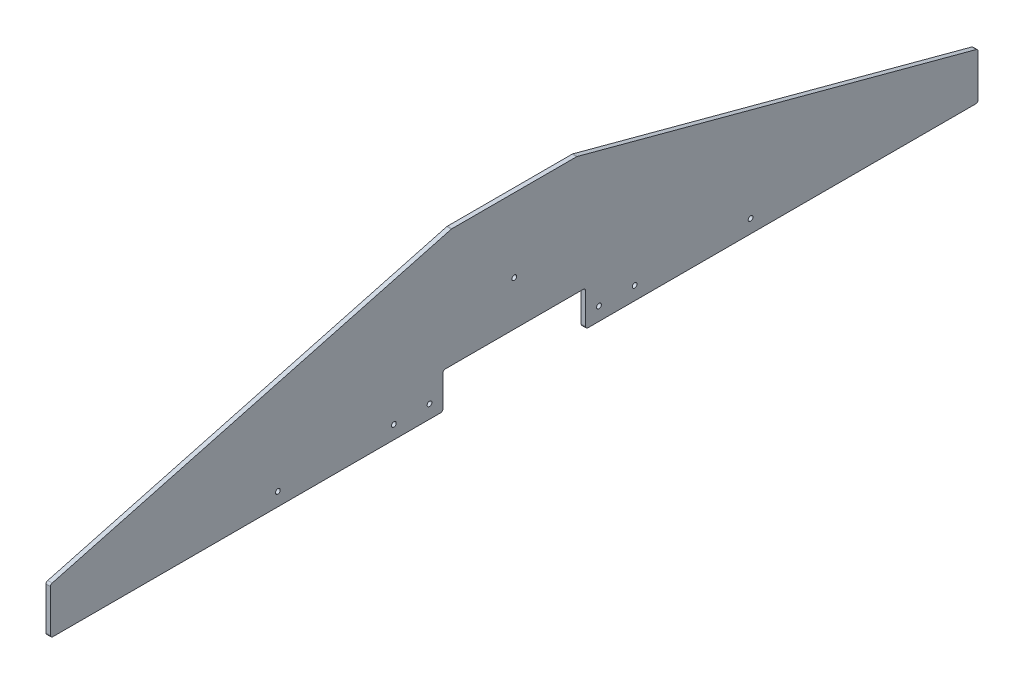
ISO-10303-21;
HEADER;
FILE_DESCRIPTION(('STEP AP214'),'2;1');
FILE_NAME('part.step','',(''),(''),'','','');
FILE_SCHEMA(('AUTOMOTIVE_DESIGN { 1 0 10303 214 1 1 1 1 }'));
ENDSEC;
DATA;
#1=APPLICATION_CONTEXT('core data for automotive mechanical design processes');
#2=APPLICATION_PROTOCOL_DEFINITION('international standard','automotive_design',2000,#1);
#3=PRODUCT_CONTEXT('',#1,'mechanical');
#4=PRODUCT('Part','Part','',(#3));
#5=PRODUCT_RELATED_PRODUCT_CATEGORY('part','',(#4));
#6=PRODUCT_DEFINITION_FORMATION('','',#4);
#7=PRODUCT_DEFINITION_CONTEXT('part definition',#1,'design');
#8=PRODUCT_DEFINITION('design','',#6,#7);
#9=PRODUCT_DEFINITION_SHAPE('','',#8);
#10=(LENGTH_UNIT() NAMED_UNIT(*) SI_UNIT(.MILLI.,.METRE.));
#11=(NAMED_UNIT(*) PLANE_ANGLE_UNIT() SI_UNIT($,.RADIAN.));
#12=(NAMED_UNIT(*) SI_UNIT($,.STERADIAN.) SOLID_ANGLE_UNIT());
#13=UNCERTAINTY_MEASURE_WITH_UNIT(LENGTH_MEASURE(1.E-05),#10,'distance_accuracy_value','');
#14=(GEOMETRIC_REPRESENTATION_CONTEXT(3) GLOBAL_UNCERTAINTY_ASSIGNED_CONTEXT((#13)) GLOBAL_UNIT_ASSIGNED_CONTEXT((#10,
#11,#12)) REPRESENTATION_CONTEXT('',''));
#15=CARTESIAN_POINT('',(0.,0.,0.));
#16=DIRECTION('',(0.,0.,1.));
#17=DIRECTION('',(1.,0.,0.));
#18=AXIS2_PLACEMENT_3D('',#15,#16,#17);
#19=CARTESIAN_POINT('',(6.35,0.,0.));
#20=DIRECTION('',(1.,0.,0.));
#21=DIRECTION('',(0.,0.,-1.));
#22=AXIS2_PLACEMENT_3D('',#19,#20,#21);
#23=PLANE('',#22);
#24=CARTESIAN_POINT('',(6.35000000000002,19.05,-336.55));
#25=DIRECTION('',(-1.,0.,0.));
#26=DIRECTION('',(0.,0.,1.));
#27=AXIS2_PLACEMENT_3D('',#24,#25,#26);
#28=CIRCLE('',#27,3.37819999999997);
#29=CARTESIAN_POINT('',(6.35000000000002,19.05,-333.1718));
#30=VERTEX_POINT('',#29);
#31=EDGE_CURVE('E496',#30,#30,#28,.T.);
#32=ORIENTED_EDGE('',*,*,#31,.T.);
#33=EDGE_LOOP('',(#32));
#34=FACE_BOUND('',#33,.T.);
#35=CARTESIAN_POINT('',(6.35000000000002,19.05,-120.65));
#36=DIRECTION('',(-1.,0.,0.));
#37=DIRECTION('',(0.,0.,1.));
#38=AXIS2_PLACEMENT_3D('',#35,#36,#37);
#39=CIRCLE('',#38,3.37819999999997);
#40=CARTESIAN_POINT('',(6.35000000000002,19.05,-117.2718));
#41=VERTEX_POINT('',#40);
#42=EDGE_CURVE('E488',#41,#41,#39,.T.);
#43=ORIENTED_EDGE('',*,*,#42,.T.);
#44=EDGE_LOOP('',(#43));
#45=FACE_BOUND('',#44,.T.);
#46=CARTESIAN_POINT('',(6.35000000000002,19.05,120.65));
#47=DIRECTION('',(-1.,0.,0.));
#48=DIRECTION('',(0.,0.,1.));
#49=AXIS2_PLACEMENT_3D('',#46,#47,#48);
#50=CIRCLE('',#49,3.37819999999997);
#51=CARTESIAN_POINT('',(6.35000000000002,19.05,124.0282));
#52=VERTEX_POINT('',#51);
#53=EDGE_CURVE('E480',#52,#52,#50,.T.);
#54=ORIENTED_EDGE('',*,*,#53,.T.);
#55=EDGE_LOOP('',(#54));
#56=FACE_BOUND('',#55,.T.);
#57=CARTESIAN_POINT('',(6.35000000000002,19.05,336.55));
#58=DIRECTION('',(-1.,0.,0.));
#59=DIRECTION('',(0.,0.,1.));
#60=AXIS2_PLACEMENT_3D('',#57,#58,#59);
#61=CIRCLE('',#60,3.37819999999997);
#62=CARTESIAN_POINT('',(6.35000000000002,19.05,339.9282));
#63=VERTEX_POINT('',#62);
#64=EDGE_CURVE('E472',#63,#63,#61,.T.);
#65=ORIENTED_EDGE('',*,*,#64,.T.);
#66=EDGE_LOOP('',(#65));
#67=FACE_BOUND('',#66,.T.);
#68=DIRECTION('',(0.,0.258819045102518,0.965925826289069));
#69=VECTOR('',#68,1.);
#70=CARTESIAN_POINT('',(6.35,219.075,-89.2656046636911));
#71=LINE('',#70,#69);
#72=CARTESIAN_POINT('',(6.35,66.6957733641,-657.952620486928));
#73=VERTEX_POINT('',#72);
#74=CARTESIAN_POINT('',(6.35,218.962487078406,-89.685508603586));
#75=VERTEX_POINT('',#74);
#76=EDGE_CURVE('E232',#73,#75,#71,.T.);
#77=ORIENTED_EDGE('',*,*,#76,.T.);
#78=CARTESIAN_POINT('',(6.35,215.773,-88.8308881166575));
#79=DIRECTION('',(1.,0.,0.));
#80=DIRECTION('',(0.,0.,-1.));
#81=AXIS2_PLACEMENT_3D('',#78,#79,#80);
#82=CIRCLE('',#81,3.302);
#83=CARTESIAN_POINT('',(6.35,219.075,-88.8308881166575));
#84=VERTEX_POINT('',#83);
#85=EDGE_CURVE('E332',#75,#84,#82,.T.);
#86=ORIENTED_EDGE('',*,*,#85,.T.);
#87=DIRECTION('',(0.,0.,1.));
#88=VECTOR('',#87,1.);
#89=CARTESIAN_POINT('',(6.35,219.075,-89.2656046636911));
#90=LINE('',#89,#88);
#91=CARTESIAN_POINT('',(6.35,219.075,88.8308881166575));
#92=VERTEX_POINT('',#91);
#93=EDGE_CURVE('E235',#84,#92,#90,.T.);
#94=ORIENTED_EDGE('',*,*,#93,.T.);
#95=CARTESIAN_POINT('',(6.35,215.773,88.8308881166575));
#96=DIRECTION('',(1.,0.,0.));
#97=DIRECTION('',(0.,0.,-1.));
#98=AXIS2_PLACEMENT_3D('',#95,#96,#97);
#99=CIRCLE('',#98,3.302);
#100=CARTESIAN_POINT('',(6.35,218.962487078406,89.685508603586));
#101=VERTEX_POINT('',#100);
#102=EDGE_CURVE('E329',#92,#101,#99,.T.);
#103=ORIENTED_EDGE('',*,*,#102,.T.);
#104=DIRECTION('',(0.,-0.258819045102518,0.965925826289069));
#105=VECTOR('',#104,1.);
#106=CARTESIAN_POINT('',(6.35,219.075,89.2656046636911));
#107=LINE('',#106,#105);
#108=CARTESIAN_POINT('',(6.35,66.6957733641,657.952620486928));
#109=VERTEX_POINT('',#108);
#110=EDGE_CURVE('E239',#101,#109,#107,.T.);
#111=ORIENTED_EDGE('',*,*,#110,.T.);
#112=CARTESIAN_POINT('',(6.35,63.5062862856934,657.098));
#113=DIRECTION('',(1.,0.,0.));
#114=DIRECTION('',(0.,0.,-1.));
#115=AXIS2_PLACEMENT_3D('',#112,#113,#114);
#116=CIRCLE('',#115,3.302);
#117=CARTESIAN_POINT('',(6.35,63.5062862856934,660.4));
#118=VERTEX_POINT('',#117);
#119=EDGE_CURVE('E326',#109,#118,#116,.T.);
#120=ORIENTED_EDGE('',*,*,#119,.T.);
#121=DIRECTION('',(0.,-1.,0.));
#122=VECTOR('',#121,1.);
#123=CARTESIAN_POINT('',(6.35,66.04,660.4));
#124=LINE('',#123,#122);
#125=CARTESIAN_POINT('',(6.35,3.302,660.4));
#126=VERTEX_POINT('',#125);
#127=EDGE_CURVE('E220',#118,#126,#124,.T.);
#128=ORIENTED_EDGE('',*,*,#127,.T.);
#129=CARTESIAN_POINT('',(6.35,3.302,657.098));
#130=DIRECTION('',(1.,0.,0.));
#131=DIRECTION('',(0.,0.,-1.));
#132=AXIS2_PLACEMENT_3D('',#129,#130,#131);
#133=CIRCLE('',#132,3.302);
#134=CARTESIAN_POINT('',(6.35,0.,657.098));
#135=VERTEX_POINT('',#134);
#136=EDGE_CURVE('E62',#126,#135,#133,.T.);
#137=ORIENTED_EDGE('',*,*,#136,.T.);
#138=DIRECTION('',(0.,0.,-1.));
#139=VECTOR('',#138,1.);
#140=CARTESIAN_POINT('',(6.35,0.,660.4));
#141=LINE('',#140,#139);
#142=CARTESIAN_POINT('',(6.35,0.,104.902));
#143=VERTEX_POINT('',#142);
#144=EDGE_CURVE('E225',#135,#143,#141,.T.);
#145=ORIENTED_EDGE('',*,*,#144,.T.);
#146=CARTESIAN_POINT('',(6.35,3.302,104.902));
#147=DIRECTION('',(1.,0.,0.));
#148=DIRECTION('',(0.,0.,-1.));
#149=AXIS2_PLACEMENT_3D('',#146,#147,#148);
#150=CIRCLE('',#149,3.302);
#151=CARTESIAN_POINT('',(6.35,3.302,101.6));
#152=VERTEX_POINT('',#151);
#153=EDGE_CURVE('E54',#143,#152,#150,.T.);
#154=ORIENTED_EDGE('',*,*,#153,.T.);
#155=DIRECTION('',(0.,-1.,0.));
#156=VECTOR('',#155,1.);
#157=CARTESIAN_POINT('',(6.35,0.,101.6));
#158=LINE('',#157,#156);
#159=CARTESIAN_POINT('',(6.35,47.498,101.6));
#160=VERTEX_POINT('',#159);
#161=EDGE_CURVE('E207',#160,#152,#158,.T.);
#162=ORIENTED_EDGE('',*,*,#161,.F.);
#163=CARTESIAN_POINT('',(6.35,47.498,98.298));
#164=DIRECTION('',(1.,0.,0.));
#165=DIRECTION('',(0.,0.,-1.));
#166=AXIS2_PLACEMENT_3D('',#163,#164,#165);
#167=CIRCLE('',#166,3.302);
#168=CARTESIAN_POINT('',(6.35,50.8,98.298));
#169=VERTEX_POINT('',#168);
#170=EDGE_CURVE('E47',#160,#169,#167,.F.);
#171=ORIENTED_EDGE('',*,*,#170,.T.);
#172=DIRECTION('',(0.,0.,1.));
#173=VECTOR('',#172,1.);
#174=CARTESIAN_POINT('',(6.35,50.8,101.6));
#175=LINE('',#174,#173);
#176=CARTESIAN_POINT('',(6.35,50.8,-98.298));
#177=VERTEX_POINT('',#176);
#178=EDGE_CURVE('E195',#177,#169,#175,.T.);
#179=ORIENTED_EDGE('',*,*,#178,.F.);
#180=CARTESIAN_POINT('',(6.35,47.498,-98.298));
#181=DIRECTION('',(1.,0.,0.));
#182=DIRECTION('',(0.,0.,-1.));
#183=AXIS2_PLACEMENT_3D('',#180,#181,#182);
#184=CIRCLE('',#183,3.302);
#185=CARTESIAN_POINT('',(6.35,47.498,-101.6));
#186=VERTEX_POINT('',#185);
#187=EDGE_CURVE('E178',#177,#186,#184,.F.);
#188=ORIENTED_EDGE('',*,*,#187,.T.);
#189=DIRECTION('',(0.,1.,0.));
#190=VECTOR('',#189,1.);
#191=CARTESIAN_POINT('',(6.35,50.8,-101.6));
#192=LINE('',#191,#190);
#193=CARTESIAN_POINT('',(6.35,3.302,-101.6));
#194=VERTEX_POINT('',#193);
#195=EDGE_CURVE('E208',#194,#186,#192,.T.);
#196=ORIENTED_EDGE('',*,*,#195,.F.);
#197=CARTESIAN_POINT('',(6.35,3.302,-104.902));
#198=DIRECTION('',(1.,0.,0.));
#199=DIRECTION('',(0.,0.,-1.));
#200=AXIS2_PLACEMENT_3D('',#197,#198,#199);
#201=CIRCLE('',#200,3.302);
#202=CARTESIAN_POINT('',(6.35,0.,-104.902));
#203=VERTEX_POINT('',#202);
#204=EDGE_CURVE('E319',#194,#203,#201,.T.);
#205=ORIENTED_EDGE('',*,*,#204,.T.);
#206=CARTESIAN_POINT('',(6.35,0.,-657.098));
#207=VERTEX_POINT('',#206);
#208=EDGE_CURVE('E223',#203,#207,#141,.T.);
#209=ORIENTED_EDGE('',*,*,#208,.T.);
#210=CARTESIAN_POINT('',(6.35,3.302,-657.098));
#211=DIRECTION('',(1.,0.,0.));
#212=DIRECTION('',(0.,0.,-1.));
#213=AXIS2_PLACEMENT_3D('',#210,#211,#212);
#214=CIRCLE('',#213,3.302);
#215=CARTESIAN_POINT('',(6.35,3.302,-660.4));
#216=VERTEX_POINT('',#215);
#217=EDGE_CURVE('E313',#207,#216,#214,.T.);
#218=ORIENTED_EDGE('',*,*,#217,.T.);
#219=DIRECTION('',(0.,1.,0.));
#220=VECTOR('',#219,1.);
#221=CARTESIAN_POINT('',(6.35,66.04,-660.4));
#222=LINE('',#221,#220);
#223=CARTESIAN_POINT('',(6.35,63.5062862856935,-660.4));
#224=VERTEX_POINT('',#223);
#225=EDGE_CURVE('E228',#216,#224,#222,.T.);
#226=ORIENTED_EDGE('',*,*,#225,.T.);
#227=CARTESIAN_POINT('',(6.35,63.5062862856935,-657.098));
#228=DIRECTION('',(1.,0.,0.));
#229=DIRECTION('',(0.,0.,-1.));
#230=AXIS2_PLACEMENT_3D('',#227,#228,#229);
#231=CIRCLE('',#230,3.302);
#232=EDGE_CURVE('E316',#224,#73,#231,.T.);
#233=ORIENTED_EDGE('',*,*,#232,.T.);
#234=EDGE_LOOP('',(#77,#86,#94,#103,#111,#120,#128,#137,#145,#154,#162,#171,#179,#188,#196,#205,
#209,#218,#226,#233));
#235=FACE_BOUND('',#234,.T.);
#236=CARTESIAN_POINT('',(6.35000000000002,19.05,171.45));
#237=DIRECTION('',(-1.,0.,0.));
#238=DIRECTION('',(0.,0.,1.));
#239=AXIS2_PLACEMENT_3D('',#236,#237,#238);
#240=CIRCLE('',#239,3.37819999999996);
#241=CARTESIAN_POINT('',(6.35000000000002,19.05,174.8282));
#242=VERTEX_POINT('',#241);
#243=EDGE_CURVE('E216',#242,#242,#240,.T.);
#244=ORIENTED_EDGE('',*,*,#243,.T.);
#245=EDGE_LOOP('',(#244));
#246=FACE_BOUND('',#245,.T.);
#247=CARTESIAN_POINT('',(6.35000000000002,19.05,-171.45));
#248=DIRECTION('',(-1.,0.,0.));
#249=DIRECTION('',(0.,0.,1.));
#250=AXIS2_PLACEMENT_3D('',#247,#248,#249);
#251=CIRCLE('',#250,3.37819999999996);
#252=CARTESIAN_POINT('',(6.35000000000002,19.05,-168.0718));
#253=VERTEX_POINT('',#252);
#254=EDGE_CURVE('E456',#253,#253,#251,.T.);
#255=ORIENTED_EDGE('',*,*,#254,.T.);
#256=EDGE_LOOP('',(#255));
#257=FACE_BOUND('',#256,.T.);
#258=CARTESIAN_POINT('',(6.35000000000002,114.3,0.));
#259=DIRECTION('',(-1.,0.,0.));
#260=DIRECTION('',(0.,0.,1.));
#261=AXIS2_PLACEMENT_3D('',#258,#259,#260);
#262=CIRCLE('',#261,3.37819999999997);
#263=CARTESIAN_POINT('',(6.35000000000002,114.3,3.37819999999997));
#264=VERTEX_POINT('',#263);
#265=EDGE_CURVE('E464',#264,#264,#262,.T.);
#266=ORIENTED_EDGE('',*,*,#265,.T.);
#267=EDGE_LOOP('',(#266));
#268=FACE_BOUND('',#267,.T.);
#269=ADVANCED_FACE('F38',(#34,#45,#56,#67,#235,#246,#257,#268),#23,.T.);
#270=CARTESIAN_POINT('',(0.,0.,0.));
#271=DIRECTION('',(1.,0.,0.));
#272=DIRECTION('',(0.,0.,-1.));
#273=AXIS2_PLACEMENT_3D('',#270,#271,#272);
#274=PLANE('',#273);
#275=CARTESIAN_POINT('',(0.,19.05,-336.55));
#276=DIRECTION('',(-1.,0.,0.));
#277=DIRECTION('',(0.,0.,1.));
#278=AXIS2_PLACEMENT_3D('',#275,#276,#277);
#279=CIRCLE('',#278,3.37819999999999);
#280=CARTESIAN_POINT('',(0.,19.05,-333.1718));
#281=VERTEX_POINT('',#280);
#282=EDGE_CURVE('E500',#281,#281,#279,.T.);
#283=ORIENTED_EDGE('',*,*,#282,.F.);
#284=EDGE_LOOP('',(#283));
#285=FACE_BOUND('',#284,.T.);
#286=CARTESIAN_POINT('',(0.,19.05,-120.65));
#287=DIRECTION('',(-1.,0.,0.));
#288=DIRECTION('',(0.,0.,1.));
#289=AXIS2_PLACEMENT_3D('',#286,#287,#288);
#290=CIRCLE('',#289,3.37819999999999);
#291=CARTESIAN_POINT('',(0.,19.05,-117.2718));
#292=VERTEX_POINT('',#291);
#293=EDGE_CURVE('E492',#292,#292,#290,.T.);
#294=ORIENTED_EDGE('',*,*,#293,.F.);
#295=EDGE_LOOP('',(#294));
#296=FACE_BOUND('',#295,.T.);
#297=CARTESIAN_POINT('',(0.,19.05,120.65));
#298=DIRECTION('',(-1.,0.,0.));
#299=DIRECTION('',(0.,0.,1.));
#300=AXIS2_PLACEMENT_3D('',#297,#298,#299);
#301=CIRCLE('',#300,3.37819999999999);
#302=CARTESIAN_POINT('',(0.,19.05,124.0282));
#303=VERTEX_POINT('',#302);
#304=EDGE_CURVE('E484',#303,#303,#301,.T.);
#305=ORIENTED_EDGE('',*,*,#304,.F.);
#306=EDGE_LOOP('',(#305));
#307=FACE_BOUND('',#306,.T.);
#308=CARTESIAN_POINT('',(0.,19.05,336.55));
#309=DIRECTION('',(-1.,0.,0.));
#310=DIRECTION('',(0.,0.,1.));
#311=AXIS2_PLACEMENT_3D('',#308,#309,#310);
#312=CIRCLE('',#311,3.37819999999999);
#313=CARTESIAN_POINT('',(0.,19.05,339.9282));
#314=VERTEX_POINT('',#313);
#315=EDGE_CURVE('E476',#314,#314,#312,.T.);
#316=ORIENTED_EDGE('',*,*,#315,.F.);
#317=EDGE_LOOP('',(#316));
#318=FACE_BOUND('',#317,.T.);
#319=CARTESIAN_POINT('',(0.,114.3,0.));
#320=DIRECTION('',(-1.,0.,0.));
#321=DIRECTION('',(0.,0.,1.));
#322=AXIS2_PLACEMENT_3D('',#319,#320,#321);
#323=CIRCLE('',#322,3.37819999999998);
#324=CARTESIAN_POINT('',(0.,114.3,3.37819999999998));
#325=VERTEX_POINT('',#324);
#326=EDGE_CURVE('E468',#325,#325,#323,.T.);
#327=ORIENTED_EDGE('',*,*,#326,.F.);
#328=EDGE_LOOP('',(#327));
#329=FACE_BOUND('',#328,.T.);
#330=CARTESIAN_POINT('',(0.,19.05,-171.45));
#331=DIRECTION('',(-1.,0.,0.));
#332=DIRECTION('',(0.,0.,1.));
#333=AXIS2_PLACEMENT_3D('',#330,#331,#332);
#334=CIRCLE('',#333,3.37819999999999);
#335=CARTESIAN_POINT('',(0.,19.05,-168.0718));
#336=VERTEX_POINT('',#335);
#337=EDGE_CURVE('E460',#336,#336,#334,.T.);
#338=ORIENTED_EDGE('',*,*,#337,.F.);
#339=EDGE_LOOP('',(#338));
#340=FACE_BOUND('',#339,.T.);
#341=DIRECTION('',(0.,0.,1.));
#342=VECTOR('',#341,1.);
#343=CARTESIAN_POINT('',(0.,219.075,-89.2656046636911));
#344=LINE('',#343,#342);
#345=CARTESIAN_POINT('',(0.,219.075,-88.8308881166575));
#346=VERTEX_POINT('',#345);
#347=CARTESIAN_POINT('',(0.,219.075,88.8308881166575));
#348=VERTEX_POINT('',#347);
#349=EDGE_CURVE('E261',#346,#348,#344,.T.);
#350=ORIENTED_EDGE('',*,*,#349,.F.);
#351=CARTESIAN_POINT('',(0.,215.773,-88.8308881166575));
#352=DIRECTION('',(1.,0.,0.));
#353=DIRECTION('',(0.,0.,-1.));
#354=AXIS2_PLACEMENT_3D('',#351,#352,#353);
#355=CIRCLE('',#354,3.302);
#356=CARTESIAN_POINT('',(0.,218.962487078406,-89.685508603586));
#357=VERTEX_POINT('',#356);
#358=EDGE_CURVE('E303',#346,#357,#355,.F.);
#359=ORIENTED_EDGE('',*,*,#358,.T.);
#360=DIRECTION('',(0.,0.258819045102518,0.965925826289069));
#361=VECTOR('',#360,1.);
#362=CARTESIAN_POINT('',(0.,219.075,-89.2656046636911));
#363=LINE('',#362,#361);
#364=CARTESIAN_POINT('',(0.,66.6957733641,-657.952620486928));
#365=VERTEX_POINT('',#364);
#366=EDGE_CURVE('E257',#365,#357,#363,.T.);
#367=ORIENTED_EDGE('',*,*,#366,.F.);
#368=CARTESIAN_POINT('',(0.,63.5062862856935,-657.098));
#369=DIRECTION('',(1.,0.,0.));
#370=DIRECTION('',(0.,0.,-1.));
#371=AXIS2_PLACEMENT_3D('',#368,#369,#370);
#372=CIRCLE('',#371,3.302);
#373=CARTESIAN_POINT('',(0.,63.5062862856935,-660.4));
#374=VERTEX_POINT('',#373);
#375=EDGE_CURVE('E285',#365,#374,#372,.F.);
#376=ORIENTED_EDGE('',*,*,#375,.T.);
#377=DIRECTION('',(0.,1.,0.));
#378=VECTOR('',#377,1.);
#379=CARTESIAN_POINT('',(0.,66.04,-660.4));
#380=LINE('',#379,#378);
#381=CARTESIAN_POINT('',(0.,3.302,-660.4));
#382=VERTEX_POINT('',#381);
#383=EDGE_CURVE('E253',#382,#374,#380,.T.);
#384=ORIENTED_EDGE('',*,*,#383,.F.);
#385=CARTESIAN_POINT('',(0.,3.302,-657.098));
#386=DIRECTION('',(1.,0.,0.));
#387=DIRECTION('',(0.,0.,-1.));
#388=AXIS2_PLACEMENT_3D('',#385,#386,#387);
#389=CIRCLE('',#388,3.302);
#390=CARTESIAN_POINT('',(0.,0.,-657.098));
#391=VERTEX_POINT('',#390);
#392=EDGE_CURVE('E282',#382,#391,#389,.F.);
#393=ORIENTED_EDGE('',*,*,#392,.T.);
#394=DIRECTION('',(0.,0.,-1.));
#395=VECTOR('',#394,1.);
#396=CARTESIAN_POINT('',(0.,0.,660.4));
#397=LINE('',#396,#395);
#398=CARTESIAN_POINT('',(0.,0.,-104.902));
#399=VERTEX_POINT('',#398);
#400=EDGE_CURVE('E247',#399,#391,#397,.T.);
#401=ORIENTED_EDGE('',*,*,#400,.F.);
#402=CARTESIAN_POINT('',(0.,3.302,-104.902));
#403=DIRECTION('',(1.,0.,0.));
#404=DIRECTION('',(0.,0.,-1.));
#405=AXIS2_PLACEMENT_3D('',#402,#403,#404);
#406=CIRCLE('',#405,3.302);
#407=CARTESIAN_POINT('',(0.,3.302,-101.6));
#408=VERTEX_POINT('',#407);
#409=EDGE_CURVE('E288',#399,#408,#406,.F.);
#410=ORIENTED_EDGE('',*,*,#409,.T.);
#411=DIRECTION('',(0.,1.,0.));
#412=VECTOR('',#411,1.);
#413=CARTESIAN_POINT('',(0.,50.8,-101.6));
#414=LINE('',#413,#412);
#415=CARTESIAN_POINT('',(0.,47.498,-101.6));
#416=VERTEX_POINT('',#415);
#417=EDGE_CURVE('E214',#408,#416,#414,.T.);
#418=ORIENTED_EDGE('',*,*,#417,.T.);
#419=CARTESIAN_POINT('',(0.,47.498,-98.298));
#420=DIRECTION('',(1.,0.,0.));
#421=DIRECTION('',(0.,0.,-1.));
#422=AXIS2_PLACEMENT_3D('',#419,#420,#421);
#423=CIRCLE('',#422,3.302);
#424=CARTESIAN_POINT('',(0.,50.8,-98.298));
#425=VERTEX_POINT('',#424);
#426=EDGE_CURVE('E188',#416,#425,#423,.T.);
#427=ORIENTED_EDGE('',*,*,#426,.T.);
#428=DIRECTION('',(0.,0.,1.));
#429=VECTOR('',#428,1.);
#430=CARTESIAN_POINT('',(0.,50.8,101.6));
#431=LINE('',#430,#429);
#432=CARTESIAN_POINT('',(0.,50.8,98.298));
#433=VERTEX_POINT('',#432);
#434=EDGE_CURVE('E198',#425,#433,#431,.T.);
#435=ORIENTED_EDGE('',*,*,#434,.T.);
#436=CARTESIAN_POINT('',(0.,47.498,98.298));
#437=DIRECTION('',(1.,0.,0.));
#438=DIRECTION('',(0.,0.,-1.));
#439=AXIS2_PLACEMENT_3D('',#436,#437,#438);
#440=CIRCLE('',#439,3.302);
#441=CARTESIAN_POINT('',(0.,47.498,101.6));
#442=VERTEX_POINT('',#441);
#443=EDGE_CURVE('E11',#433,#442,#440,.T.);
#444=ORIENTED_EDGE('',*,*,#443,.T.);
#445=DIRECTION('',(0.,-1.,0.));
#446=VECTOR('',#445,1.);
#447=CARTESIAN_POINT('',(0.,0.,101.6));
#448=LINE('',#447,#446);
#449=CARTESIAN_POINT('',(0.,3.302,101.6));
#450=VERTEX_POINT('',#449);
#451=EDGE_CURVE('E248',#442,#450,#448,.T.);
#452=ORIENTED_EDGE('',*,*,#451,.T.);
#453=CARTESIAN_POINT('',(0.,3.302,104.902));
#454=DIRECTION('',(1.,0.,0.));
#455=DIRECTION('',(0.,0.,-1.));
#456=AXIS2_PLACEMENT_3D('',#453,#454,#455);
#457=CIRCLE('',#456,3.302);
#458=CARTESIAN_POINT('',(0.,0.,104.902));
#459=VERTEX_POINT('',#458);
#460=EDGE_CURVE('E291',#450,#459,#457,.F.);
#461=ORIENTED_EDGE('',*,*,#460,.T.);
#462=CARTESIAN_POINT('',(0.,0.,657.098));
#463=VERTEX_POINT('',#462);
#464=EDGE_CURVE('E252',#463,#459,#397,.T.);
#465=ORIENTED_EDGE('',*,*,#464,.F.);
#466=CARTESIAN_POINT('',(0.,3.302,657.098));
#467=DIRECTION('',(1.,0.,0.));
#468=DIRECTION('',(0.,0.,-1.));
#469=AXIS2_PLACEMENT_3D('',#466,#467,#468);
#470=CIRCLE('',#469,3.302);
#471=CARTESIAN_POINT('',(0.,3.302,660.4));
#472=VERTEX_POINT('',#471);
#473=EDGE_CURVE('E294',#463,#472,#470,.F.);
#474=ORIENTED_EDGE('',*,*,#473,.T.);
#475=DIRECTION('',(0.,-1.,0.));
#476=VECTOR('',#475,1.);
#477=CARTESIAN_POINT('',(0.,66.04,660.4));
#478=LINE('',#477,#476);
#479=CARTESIAN_POINT('',(0.,63.5062862856934,660.4));
#480=VERTEX_POINT('',#479);
#481=EDGE_CURVE('E243',#480,#472,#478,.T.);
#482=ORIENTED_EDGE('',*,*,#481,.F.);
#483=CARTESIAN_POINT('',(0.,63.5062862856934,657.098));
#484=DIRECTION('',(1.,0.,0.));
#485=DIRECTION('',(0.,0.,-1.));
#486=AXIS2_PLACEMENT_3D('',#483,#484,#485);
#487=CIRCLE('',#486,3.302);
#488=CARTESIAN_POINT('',(0.,66.6957733641,657.952620486928));
#489=VERTEX_POINT('',#488);
#490=EDGE_CURVE('E297',#480,#489,#487,.F.);
#491=ORIENTED_EDGE('',*,*,#490,.T.);
#492=DIRECTION('',(0.,-0.258819045102518,0.965925826289069));
#493=VECTOR('',#492,1.);
#494=CARTESIAN_POINT('',(0.,219.075,89.2656046636911));
#495=LINE('',#494,#493);
#496=CARTESIAN_POINT('',(0.,218.962487078406,89.685508603586));
#497=VERTEX_POINT('',#496);
#498=EDGE_CURVE('E224',#497,#489,#495,.T.);
#499=ORIENTED_EDGE('',*,*,#498,.F.);
#500=CARTESIAN_POINT('',(0.,215.773,88.8308881166575));
#501=DIRECTION('',(1.,0.,0.));
#502=DIRECTION('',(0.,0.,-1.));
#503=AXIS2_PLACEMENT_3D('',#500,#501,#502);
#504=CIRCLE('',#503,3.302);
#505=EDGE_CURVE('E300',#497,#348,#504,.F.);
#506=ORIENTED_EDGE('',*,*,#505,.T.);
#507=EDGE_LOOP('',(#350,#359,#367,#376,#384,#393,#401,#410,#418,#427,#435,#444,#452,#461,#465,
#474,#482,#491,#499,#506));
#508=FACE_BOUND('',#507,.T.);
#509=CARTESIAN_POINT('',(0.,19.05,171.45));
#510=DIRECTION('',(-1.,0.,0.));
#511=DIRECTION('',(0.,0.,1.));
#512=AXIS2_PLACEMENT_3D('',#509,#510,#511);
#513=CIRCLE('',#512,3.37819999999999);
#514=CARTESIAN_POINT('',(0.,19.05,174.8282));
#515=VERTEX_POINT('',#514);
#516=EDGE_CURVE('E452',#515,#515,#513,.T.);
#517=ORIENTED_EDGE('',*,*,#516,.F.);
#518=EDGE_LOOP('',(#517));
#519=FACE_BOUND('',#518,.T.);
#520=ADVANCED_FACE('F508',(#285,#296,#307,#318,#329,#340,#508,#519),#274,.F.);
#521=CARTESIAN_POINT('',(6.35,0.,660.4));
#522=DIRECTION('',(0.,1.,0.));
#523=DIRECTION('',(0.,0.,1.));
#524=AXIS2_PLACEMENT_3D('',#521,#522,#523);
#525=PLANE('',#524);
#526=ORIENTED_EDGE('',*,*,#144,.F.);
#527=DIRECTION('',(-1.,0.,0.));
#528=VECTOR('',#527,1.);
#529=CARTESIAN_POINT('',(6.35,0.,657.098));
#530=LINE('',#529,#528);
#531=EDGE_CURVE('E352',#135,#463,#530,.T.);
#532=ORIENTED_EDGE('',*,*,#531,.T.);
#533=ORIENTED_EDGE('',*,*,#464,.T.);
#534=DIRECTION('',(1.,0.,0.));
#535=VECTOR('',#534,1.);
#536=CARTESIAN_POINT('',(6.35,0.,104.902));
#537=LINE('',#536,#535);
#538=EDGE_CURVE('E349',#459,#143,#537,.T.);
#539=ORIENTED_EDGE('',*,*,#538,.T.);
#540=EDGE_LOOP('',(#526,#532,#533,#539));
#541=FACE_BOUND('',#540,.T.);
#542=ADVANCED_FACE('F511',(#541),#525,.F.);
#543=CARTESIAN_POINT('',(6.35,66.04,660.4));
#544=DIRECTION('',(0.,0.,-1.));
#545=DIRECTION('',(-1.,0.,0.));
#546=AXIS2_PLACEMENT_3D('',#543,#544,#545);
#547=PLANE('',#546);
#548=ORIENTED_EDGE('',*,*,#127,.F.);
#549=DIRECTION('',(-1.,0.,0.));
#550=VECTOR('',#549,1.);
#551=CARTESIAN_POINT('',(6.35,63.5062862856934,660.4));
#552=LINE('',#551,#550);
#553=EDGE_CURVE('E345',#118,#480,#552,.T.);
#554=ORIENTED_EDGE('',*,*,#553,.T.);
#555=ORIENTED_EDGE('',*,*,#481,.T.);
#556=DIRECTION('',(-1.,0.,0.));
#557=VECTOR('',#556,1.);
#558=CARTESIAN_POINT('',(6.35,3.302,660.4));
#559=LINE('',#558,#557);
#560=EDGE_CURVE('E342',#472,#126,#559,.F.);
#561=ORIENTED_EDGE('',*,*,#560,.T.);
#562=EDGE_LOOP('',(#548,#554,#555,#561));
#563=FACE_BOUND('',#562,.T.);
#564=ADVANCED_FACE('F571',(#563),#547,.F.);
#565=ORIENTED_EDGE('',*,*,#208,.F.);
#566=DIRECTION('',(1.,0.,0.));
#567=VECTOR('',#566,1.);
#568=CARTESIAN_POINT('',(6.35,0.,-104.902));
#569=LINE('',#568,#567);
#570=EDGE_CURVE('E366',#203,#399,#569,.F.);
#571=ORIENTED_EDGE('',*,*,#570,.T.);
#572=ORIENTED_EDGE('',*,*,#400,.T.);
#573=DIRECTION('',(-1.,0.,0.));
#574=VECTOR('',#573,1.);
#575=CARTESIAN_POINT('',(6.35,0.,-657.098));
#576=LINE('',#575,#574);
#577=EDGE_CURVE('E363',#391,#207,#576,.F.);
#578=ORIENTED_EDGE('',*,*,#577,.T.);
#579=EDGE_LOOP('',(#565,#571,#572,#578));
#580=FACE_BOUND('',#579,.T.);
#581=ADVANCED_FACE('F567',(#580),#525,.F.);
#582=CARTESIAN_POINT('',(6.35,66.04,-660.4));
#583=DIRECTION('',(0.,0.,1.));
#584=DIRECTION('',(1.,0.,0.));
#585=AXIS2_PLACEMENT_3D('',#582,#583,#584);
#586=PLANE('',#585);
#587=ORIENTED_EDGE('',*,*,#383,.T.);
#588=DIRECTION('',(-1.,0.,0.));
#589=VECTOR('',#588,1.);
#590=CARTESIAN_POINT('',(6.35,63.5062862856935,-660.4));
#591=LINE('',#590,#589);
#592=EDGE_CURVE('E189',#374,#224,#591,.F.);
#593=ORIENTED_EDGE('',*,*,#592,.T.);
#594=ORIENTED_EDGE('',*,*,#225,.F.);
#595=DIRECTION('',(-1.,0.,0.));
#596=VECTOR('',#595,1.);
#597=CARTESIAN_POINT('',(6.35,3.302,-660.4));
#598=LINE('',#597,#596);
#599=EDGE_CURVE('E369',#216,#382,#598,.T.);
#600=ORIENTED_EDGE('',*,*,#599,.T.);
#601=EDGE_LOOP('',(#587,#593,#594,#600));
#602=FACE_BOUND('',#601,.T.);
#603=ADVANCED_FACE('F563',(#602),#586,.F.);
#604=CARTESIAN_POINT('',(6.35,219.075,-89.2656046636911));
#605=DIRECTION('',(0.,-0.965925826289069,0.258819045102518));
#606=DIRECTION('',(0.,-0.258819045102518,-0.965925826289069));
#607=AXIS2_PLACEMENT_3D('',#604,#605,#606);
#608=PLANE('',#607);
#609=ORIENTED_EDGE('',*,*,#366,.T.);
#610=DIRECTION('',(-1.,0.,0.));
#611=VECTOR('',#610,1.);
#612=CARTESIAN_POINT('',(6.35,218.962487078406,-89.685508603586));
#613=LINE('',#612,#611);
#614=EDGE_CURVE('E310',#357,#75,#613,.F.);
#615=ORIENTED_EDGE('',*,*,#614,.T.);
#616=ORIENTED_EDGE('',*,*,#76,.F.);
#617=DIRECTION('',(-1.,0.,0.));
#618=VECTOR('',#617,1.);
#619=CARTESIAN_POINT('',(6.35,66.6957733641,-657.952620486929));
#620=LINE('',#619,#618);
#621=EDGE_CURVE('E306',#73,#365,#620,.T.);
#622=ORIENTED_EDGE('',*,*,#621,.T.);
#623=EDGE_LOOP('',(#609,#615,#616,#622));
#624=FACE_BOUND('',#623,.T.);
#625=ADVANCED_FACE('F559',(#624),#608,.F.);
#626=CARTESIAN_POINT('',(6.35,219.075,-89.2656046636911));
#627=DIRECTION('',(0.,-1.,0.));
#628=DIRECTION('',(0.,0.,-1.));
#629=AXIS2_PLACEMENT_3D('',#626,#627,#628);
#630=PLANE('',#629);
#631=ORIENTED_EDGE('',*,*,#93,.F.);
#632=DIRECTION('',(-1.,0.,0.));
#633=VECTOR('',#632,1.);
#634=CARTESIAN_POINT('',(6.35,219.075,-88.8308881166575));
#635=LINE('',#634,#633);
#636=EDGE_CURVE('E278',#84,#346,#635,.T.);
#637=ORIENTED_EDGE('',*,*,#636,.T.);
#638=ORIENTED_EDGE('',*,*,#349,.T.);
#639=DIRECTION('',(-1.,0.,0.));
#640=VECTOR('',#639,1.);
#641=CARTESIAN_POINT('',(6.35,219.075,88.8308881166575));
#642=LINE('',#641,#640);
#643=EDGE_CURVE('E275',#348,#92,#642,.F.);
#644=ORIENTED_EDGE('',*,*,#643,.T.);
#645=EDGE_LOOP('',(#631,#637,#638,#644));
#646=FACE_BOUND('',#645,.T.);
#647=ADVANCED_FACE('F555',(#646),#630,.F.);
#648=CARTESIAN_POINT('',(6.35,219.075,89.2656046636911));
#649=DIRECTION('',(0.,-0.965925826289069,-0.258819045102518));
#650=DIRECTION('',(0.,0.258819045102518,-0.965925826289069));
#651=AXIS2_PLACEMENT_3D('',#648,#649,#650);
#652=PLANE('',#651);
#653=ORIENTED_EDGE('',*,*,#110,.F.);
#654=DIRECTION('',(-1.,0.,0.));
#655=VECTOR('',#654,1.);
#656=CARTESIAN_POINT('',(6.35,218.962487078406,89.685508603586));
#657=LINE('',#656,#655);
#658=EDGE_CURVE('E338',#101,#497,#657,.T.);
#659=ORIENTED_EDGE('',*,*,#658,.T.);
#660=ORIENTED_EDGE('',*,*,#498,.T.);
#661=DIRECTION('',(-1.,0.,0.));
#662=VECTOR('',#661,1.);
#663=CARTESIAN_POINT('',(6.35,66.6957733641,657.952620486929));
#664=LINE('',#663,#662);
#665=EDGE_CURVE('E335',#489,#109,#664,.F.);
#666=ORIENTED_EDGE('',*,*,#665,.T.);
#667=EDGE_LOOP('',(#653,#659,#660,#666));
#668=FACE_BOUND('',#667,.T.);
#669=ADVANCED_FACE('F551',(#668),#652,.F.);
#670=CARTESIAN_POINT('',(0.,0.,101.6));
#671=DIRECTION('',(0.,0.,1.));
#672=DIRECTION('',(1.,0.,0.));
#673=AXIS2_PLACEMENT_3D('',#670,#671,#672);
#674=PLANE('',#673);
#675=ORIENTED_EDGE('',*,*,#161,.T.);
#676=DIRECTION('',(1.,0.,0.));
#677=VECTOR('',#676,1.);
#678=CARTESIAN_POINT('',(0.,3.302,101.6));
#679=LINE('',#678,#677);
#680=EDGE_CURVE('E360',#152,#450,#679,.F.);
#681=ORIENTED_EDGE('',*,*,#680,.T.);
#682=ORIENTED_EDGE('',*,*,#451,.F.);
#683=DIRECTION('',(1.,0.,0.));
#684=VECTOR('',#683,1.);
#685=CARTESIAN_POINT('',(6.35,47.498,101.6));
#686=LINE('',#685,#684);
#687=EDGE_CURVE('E356',#442,#160,#686,.T.);
#688=ORIENTED_EDGE('',*,*,#687,.T.);
#689=EDGE_LOOP('',(#675,#681,#682,#688));
#690=FACE_BOUND('',#689,.T.);
#691=ADVANCED_FACE('F554',(#690),#674,.F.);
#692=CARTESIAN_POINT('',(0.,50.8,101.6));
#693=DIRECTION('',(0.,1.,0.));
#694=DIRECTION('',(0.,0.,1.));
#695=AXIS2_PLACEMENT_3D('',#692,#693,#694);
#696=PLANE('',#695);
#697=ORIENTED_EDGE('',*,*,#434,.F.);
#698=DIRECTION('',(1.,0.,0.));
#699=VECTOR('',#698,1.);
#700=CARTESIAN_POINT('',(6.35,50.8,-98.298));
#701=LINE('',#700,#699);
#702=EDGE_CURVE('E182',#425,#177,#701,.T.);
#703=ORIENTED_EDGE('',*,*,#702,.T.);
#704=ORIENTED_EDGE('',*,*,#178,.T.);
#705=DIRECTION('',(1.,0.,0.));
#706=VECTOR('',#705,1.);
#707=CARTESIAN_POINT('',(0.,50.8,98.298));
#708=LINE('',#707,#706);
#709=EDGE_CURVE('E201',#169,#433,#708,.F.);
#710=ORIENTED_EDGE('',*,*,#709,.T.);
#711=EDGE_LOOP('',(#697,#703,#704,#710));
#712=FACE_BOUND('',#711,.T.);
#713=ADVANCED_FACE('F194',(#712),#696,.F.);
#714=CARTESIAN_POINT('',(0.,50.8,-101.6));
#715=DIRECTION('',(0.,0.,-1.));
#716=DIRECTION('',(-1.,0.,0.));
#717=AXIS2_PLACEMENT_3D('',#714,#715,#716);
#718=PLANE('',#717);
#719=ORIENTED_EDGE('',*,*,#195,.T.);
#720=DIRECTION('',(1.,0.,0.));
#721=VECTOR('',#720,1.);
#722=CARTESIAN_POINT('',(0.,47.498,-101.6));
#723=LINE('',#722,#721);
#724=EDGE_CURVE('E183',#186,#416,#723,.F.);
#725=ORIENTED_EDGE('',*,*,#724,.T.);
#726=ORIENTED_EDGE('',*,*,#417,.F.);
#727=DIRECTION('',(1.,0.,0.));
#728=VECTOR('',#727,1.);
#729=CARTESIAN_POINT('',(0.,3.302,-101.6));
#730=LINE('',#729,#728);
#731=EDGE_CURVE('E200',#408,#194,#730,.T.);
#732=ORIENTED_EDGE('',*,*,#731,.T.);
#733=EDGE_LOOP('',(#719,#725,#726,#732));
#734=FACE_BOUND('',#733,.T.);
#735=ADVANCED_FACE('F529',(#734),#718,.F.);
#736=CARTESIAN_POINT('',(0.,19.05,171.45));
#737=DIRECTION('',(-1.,0.,0.));
#738=DIRECTION('',(0.,0.,1.));
#739=AXIS2_PLACEMENT_3D('',#736,#737,#738);
#740=CYLINDRICAL_SURFACE('',#739,3.37819999999998);
#741=ORIENTED_EDGE('',*,*,#243,.F.);
#742=EDGE_LOOP('',(#741));
#743=FACE_BOUND('',#742,.T.);
#744=ORIENTED_EDGE('',*,*,#516,.T.);
#745=EDGE_LOOP('',(#744));
#746=FACE_BOUND('',#745,.T.);
#747=ADVANCED_FACE('F526',(#743,#746),#740,.F.);
#748=CARTESIAN_POINT('',(0.,19.05,-171.45));
#749=DIRECTION('',(-1.,0.,0.));
#750=DIRECTION('',(0.,0.,1.));
#751=AXIS2_PLACEMENT_3D('',#748,#749,#750);
#752=CYLINDRICAL_SURFACE('',#751,3.37819999999998);
#753=ORIENTED_EDGE('',*,*,#254,.F.);
#754=EDGE_LOOP('',(#753));
#755=FACE_BOUND('',#754,.T.);
#756=ORIENTED_EDGE('',*,*,#337,.T.);
#757=EDGE_LOOP('',(#756));
#758=FACE_BOUND('',#757,.T.);
#759=ADVANCED_FACE('F528',(#755,#758),#752,.F.);
#760=CARTESIAN_POINT('',(0.,114.3,0.));
#761=DIRECTION('',(-1.,0.,0.));
#762=DIRECTION('',(0.,0.,1.));
#763=AXIS2_PLACEMENT_3D('',#760,#761,#762);
#764=CYLINDRICAL_SURFACE('',#763,3.37819999999998);
#765=ORIENTED_EDGE('',*,*,#265,.F.);
#766=EDGE_LOOP('',(#765));
#767=FACE_BOUND('',#766,.T.);
#768=ORIENTED_EDGE('',*,*,#326,.T.);
#769=EDGE_LOOP('',(#768));
#770=FACE_BOUND('',#769,.T.);
#771=ADVANCED_FACE('F536',(#767,#770),#764,.F.);
#772=CARTESIAN_POINT('',(0.,19.05,336.55));
#773=DIRECTION('',(-1.,0.,0.));
#774=DIRECTION('',(0.,0.,1.));
#775=AXIS2_PLACEMENT_3D('',#772,#773,#774);
#776=CYLINDRICAL_SURFACE('',#775,3.37819999999998);
#777=ORIENTED_EDGE('',*,*,#64,.F.);
#778=EDGE_LOOP('',(#777));
#779=FACE_BOUND('',#778,.T.);
#780=ORIENTED_EDGE('',*,*,#315,.T.);
#781=EDGE_LOOP('',(#780));
#782=FACE_BOUND('',#781,.T.);
#783=ADVANCED_FACE('F670',(#779,#782),#776,.F.);
#784=CARTESIAN_POINT('',(0.,19.05,120.65));
#785=DIRECTION('',(-1.,0.,0.));
#786=DIRECTION('',(0.,0.,1.));
#787=AXIS2_PLACEMENT_3D('',#784,#785,#786);
#788=CYLINDRICAL_SURFACE('',#787,3.37819999999998);
#789=ORIENTED_EDGE('',*,*,#53,.F.);
#790=EDGE_LOOP('',(#789));
#791=FACE_BOUND('',#790,.T.);
#792=ORIENTED_EDGE('',*,*,#304,.T.);
#793=EDGE_LOOP('',(#792));
#794=FACE_BOUND('',#793,.T.);
#795=ADVANCED_FACE('F680',(#791,#794),#788,.F.);
#796=CARTESIAN_POINT('',(0.,19.05,-120.65));
#797=DIRECTION('',(-1.,0.,0.));
#798=DIRECTION('',(0.,0.,1.));
#799=AXIS2_PLACEMENT_3D('',#796,#797,#798);
#800=CYLINDRICAL_SURFACE('',#799,3.37819999999998);
#801=ORIENTED_EDGE('',*,*,#42,.F.);
#802=EDGE_LOOP('',(#801));
#803=FACE_BOUND('',#802,.T.);
#804=ORIENTED_EDGE('',*,*,#293,.T.);
#805=EDGE_LOOP('',(#804));
#806=FACE_BOUND('',#805,.T.);
#807=ADVANCED_FACE('F690',(#803,#806),#800,.F.);
#808=CARTESIAN_POINT('',(0.,19.05,-336.55));
#809=DIRECTION('',(-1.,0.,0.));
#810=DIRECTION('',(0.,0.,1.));
#811=AXIS2_PLACEMENT_3D('',#808,#809,#810);
#812=CYLINDRICAL_SURFACE('',#811,3.37819999999998);
#813=ORIENTED_EDGE('',*,*,#31,.F.);
#814=EDGE_LOOP('',(#813));
#815=FACE_BOUND('',#814,.T.);
#816=ORIENTED_EDGE('',*,*,#282,.T.);
#817=EDGE_LOOP('',(#816));
#818=FACE_BOUND('',#817,.T.);
#819=ADVANCED_FACE('F506',(#815,#818),#812,.F.);
#820=CARTESIAN_POINT('',(0.,47.498,-98.298));
#821=DIRECTION('',(-1.,0.,0.));
#822=DIRECTION('',(0.,0.,1.));
#823=AXIS2_PLACEMENT_3D('',#820,#821,#822);
#824=CYLINDRICAL_SURFACE('',#823,3.302);
#825=ORIENTED_EDGE('',*,*,#426,.F.);
#826=ORIENTED_EDGE('',*,*,#724,.F.);
#827=ORIENTED_EDGE('',*,*,#187,.F.);
#828=ORIENTED_EDGE('',*,*,#702,.F.);
#829=EDGE_LOOP('',(#825,#826,#827,#828));
#830=FACE_BOUND('',#829,.T.);
#831=ADVANCED_FACE('F181',(#830),#824,.F.);
#832=CARTESIAN_POINT('',(6.35,215.773,-88.8308881166575));
#833=DIRECTION('',(-1.,0.,0.));
#834=DIRECTION('',(0.,0.,1.));
#835=AXIS2_PLACEMENT_3D('',#832,#833,#834);
#836=CYLINDRICAL_SURFACE('',#835,3.302);
#837=ORIENTED_EDGE('',*,*,#85,.F.);
#838=ORIENTED_EDGE('',*,*,#614,.F.);
#839=ORIENTED_EDGE('',*,*,#358,.F.);
#840=ORIENTED_EDGE('',*,*,#636,.F.);
#841=EDGE_LOOP('',(#837,#838,#839,#840));
#842=FACE_BOUND('',#841,.T.);
#843=ADVANCED_FACE('F578',(#842),#836,.T.);
#844=CARTESIAN_POINT('',(6.35,215.773,88.8308881166575));
#845=DIRECTION('',(-1.,0.,0.));
#846=DIRECTION('',(0.,0.,1.));
#847=AXIS2_PLACEMENT_3D('',#844,#845,#846);
#848=CYLINDRICAL_SURFACE('',#847,3.302);
#849=ORIENTED_EDGE('',*,*,#102,.F.);
#850=ORIENTED_EDGE('',*,*,#643,.F.);
#851=ORIENTED_EDGE('',*,*,#505,.F.);
#852=ORIENTED_EDGE('',*,*,#658,.F.);
#853=EDGE_LOOP('',(#849,#850,#851,#852));
#854=FACE_BOUND('',#853,.T.);
#855=ADVANCED_FACE('F581',(#854),#848,.T.);
#856=CARTESIAN_POINT('',(6.35,63.5062862856934,657.098));
#857=DIRECTION('',(-1.,0.,0.));
#858=DIRECTION('',(0.,0.,1.));
#859=AXIS2_PLACEMENT_3D('',#856,#857,#858);
#860=CYLINDRICAL_SURFACE('',#859,3.302);
#861=ORIENTED_EDGE('',*,*,#119,.F.);
#862=ORIENTED_EDGE('',*,*,#665,.F.);
#863=ORIENTED_EDGE('',*,*,#490,.F.);
#864=ORIENTED_EDGE('',*,*,#553,.F.);
#865=EDGE_LOOP('',(#861,#862,#863,#864));
#866=FACE_BOUND('',#865,.T.);
#867=ADVANCED_FACE('F585',(#866),#860,.T.);
#868=CARTESIAN_POINT('',(6.35,3.302,657.098));
#869=DIRECTION('',(-1.,0.,0.));
#870=DIRECTION('',(0.,0.,1.));
#871=AXIS2_PLACEMENT_3D('',#868,#869,#870);
#872=CYLINDRICAL_SURFACE('',#871,3.302);
#873=ORIENTED_EDGE('',*,*,#136,.F.);
#874=ORIENTED_EDGE('',*,*,#560,.F.);
#875=ORIENTED_EDGE('',*,*,#473,.F.);
#876=ORIENTED_EDGE('',*,*,#531,.F.);
#877=EDGE_LOOP('',(#873,#874,#875,#876));
#878=FACE_BOUND('',#877,.T.);
#879=ADVANCED_FACE('F589',(#878),#872,.T.);
#880=CARTESIAN_POINT('',(6.35,3.302,104.902));
#881=DIRECTION('',(1.,0.,0.));
#882=DIRECTION('',(0.,0.,-1.));
#883=AXIS2_PLACEMENT_3D('',#880,#881,#882);
#884=CYLINDRICAL_SURFACE('',#883,3.302);
#885=ORIENTED_EDGE('',*,*,#460,.F.);
#886=ORIENTED_EDGE('',*,*,#680,.F.);
#887=ORIENTED_EDGE('',*,*,#153,.F.);
#888=ORIENTED_EDGE('',*,*,#538,.F.);
#889=EDGE_LOOP('',(#885,#886,#887,#888));
#890=FACE_BOUND('',#889,.T.);
#891=ADVANCED_FACE('F593',(#890),#884,.T.);
#892=CARTESIAN_POINT('',(0.,47.498,98.298));
#893=DIRECTION('',(-1.,0.,0.));
#894=DIRECTION('',(0.,0.,1.));
#895=AXIS2_PLACEMENT_3D('',#892,#893,#894);
#896=CYLINDRICAL_SURFACE('',#895,3.302);
#897=ORIENTED_EDGE('',*,*,#443,.F.);
#898=ORIENTED_EDGE('',*,*,#709,.F.);
#899=ORIENTED_EDGE('',*,*,#170,.F.);
#900=ORIENTED_EDGE('',*,*,#687,.F.);
#901=EDGE_LOOP('',(#897,#898,#899,#900));
#902=FACE_BOUND('',#901,.T.);
#903=ADVANCED_FACE('F597',(#902),#896,.F.);
#904=CARTESIAN_POINT('',(0.,3.302,-104.902));
#905=DIRECTION('',(1.,0.,0.));
#906=DIRECTION('',(0.,0.,-1.));
#907=AXIS2_PLACEMENT_3D('',#904,#905,#906);
#908=CYLINDRICAL_SURFACE('',#907,3.302);
#909=ORIENTED_EDGE('',*,*,#409,.F.);
#910=ORIENTED_EDGE('',*,*,#570,.F.);
#911=ORIENTED_EDGE('',*,*,#204,.F.);
#912=ORIENTED_EDGE('',*,*,#731,.F.);
#913=EDGE_LOOP('',(#909,#910,#911,#912));
#914=FACE_BOUND('',#913,.T.);
#915=ADVANCED_FACE('F600',(#914),#908,.T.);
#916=CARTESIAN_POINT('',(6.35,63.5062862856935,-657.098));
#917=DIRECTION('',(-1.,0.,0.));
#918=DIRECTION('',(0.,0.,1.));
#919=AXIS2_PLACEMENT_3D('',#916,#917,#918);
#920=CYLINDRICAL_SURFACE('',#919,3.302);
#921=ORIENTED_EDGE('',*,*,#232,.F.);
#922=ORIENTED_EDGE('',*,*,#592,.F.);
#923=ORIENTED_EDGE('',*,*,#375,.F.);
#924=ORIENTED_EDGE('',*,*,#621,.F.);
#925=EDGE_LOOP('',(#921,#922,#923,#924));
#926=FACE_BOUND('',#925,.T.);
#927=ADVANCED_FACE('F603',(#926),#920,.T.);
#928=CARTESIAN_POINT('',(6.35,3.302,-657.098));
#929=DIRECTION('',(-1.,0.,0.));
#930=DIRECTION('',(0.,0.,1.));
#931=AXIS2_PLACEMENT_3D('',#928,#929,#930);
#932=CYLINDRICAL_SURFACE('',#931,3.302);
#933=ORIENTED_EDGE('',*,*,#217,.F.);
#934=ORIENTED_EDGE('',*,*,#577,.F.);
#935=ORIENTED_EDGE('',*,*,#392,.F.);
#936=ORIENTED_EDGE('',*,*,#599,.F.);
#937=EDGE_LOOP('',(#933,#934,#935,#936));
#938=FACE_BOUND('',#937,.T.);
#939=ADVANCED_FACE('F40',(#938),#932,.T.);
#940=CLOSED_SHELL('',(#269,#520,#542,#564,#581,#603,#625,#647,#669,#691,#713,#735,#747,#759,
#771,#783,#795,#807,#819,#831,#843,#855,#867,#879,#891,#903,#915,#927,#939));
#941=MANIFOLD_SOLID_BREP('B2',#940);
#942=ADVANCED_BREP_SHAPE_REPRESENTATION('',(#18,#941),#14);
#943=SHAPE_DEFINITION_REPRESENTATION(#9,#942);
ENDSEC;
END-ISO-10303-21;
